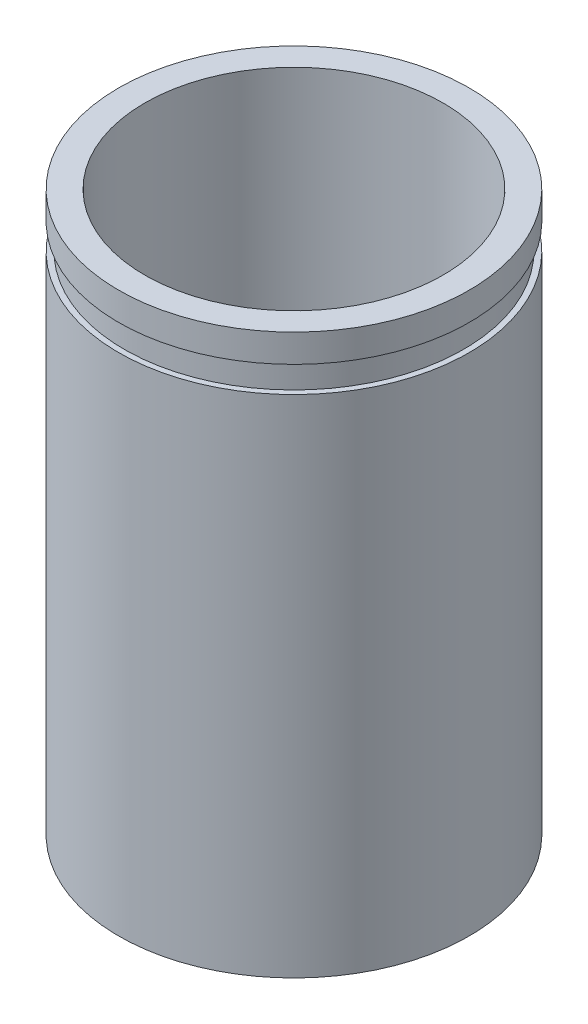
ISO-10303-21;
HEADER;
FILE_DESCRIPTION(('STEP AP214'),'2;1');
FILE_NAME('part.step','',(''),(''),'','','');
FILE_SCHEMA(('AUTOMOTIVE_DESIGN { 1 0 10303 214 1 1 1 1 }'));
ENDSEC;
DATA;
#1=APPLICATION_CONTEXT('core data for automotive mechanical design processes');
#2=APPLICATION_PROTOCOL_DEFINITION('international standard','automotive_design',2000,#1);
#3=PRODUCT_CONTEXT('',#1,'mechanical');
#4=PRODUCT('Part','Part','',(#3));
#5=PRODUCT_RELATED_PRODUCT_CATEGORY('part','',(#4));
#6=PRODUCT_DEFINITION_FORMATION('','',#4);
#7=PRODUCT_DEFINITION_CONTEXT('part definition',#1,'design');
#8=PRODUCT_DEFINITION('design','',#6,#7);
#9=PRODUCT_DEFINITION_SHAPE('','',#8);
#10=(LENGTH_UNIT() NAMED_UNIT(*) SI_UNIT(.MILLI.,.METRE.));
#11=(NAMED_UNIT(*) PLANE_ANGLE_UNIT() SI_UNIT($,.RADIAN.));
#12=(NAMED_UNIT(*) SI_UNIT($,.STERADIAN.) SOLID_ANGLE_UNIT());
#13=UNCERTAINTY_MEASURE_WITH_UNIT(LENGTH_MEASURE(1.E-05),#10,'distance_accuracy_value','');
#14=(GEOMETRIC_REPRESENTATION_CONTEXT(3) GLOBAL_UNCERTAINTY_ASSIGNED_CONTEXT((#13)) GLOBAL_UNIT_ASSIGNED_CONTEXT((#10,
#11,#12)) REPRESENTATION_CONTEXT('',''));
#15=CARTESIAN_POINT('',(0.,0.,0.));
#16=DIRECTION('',(0.,0.,1.));
#17=DIRECTION('',(1.,0.,0.));
#18=AXIS2_PLACEMENT_3D('',#15,#16,#17);
#19=CARTESIAN_POINT('',(-22.7272128154357,134.212365817062,0.));
#20=DIRECTION('',(0.,1.,0.));
#21=DIRECTION('',(-1.,0.,0.));
#22=AXIS2_PLACEMENT_3D('',#19,#20,#21);
#23=CYLINDRICAL_SURFACE('',#22,40.);
#24=CARTESIAN_POINT('',(-22.7272128154357,134.212365817062,0.));
#25=DIRECTION('',(0.,1.,0.));
#26=DIRECTION('',(-1.,0.,0.));
#27=AXIS2_PLACEMENT_3D('',#24,#25,#26);
#28=CIRCLE('',#27,40.);
#29=CARTESIAN_POINT('',(-62.7272128154357,134.212365817062,0.));
#30=VERTEX_POINT('',#29);
#31=EDGE_CURVE('E67',#30,#30,#28,.T.);
#32=ORIENTED_EDGE('',*,*,#31,.T.);
#33=EDGE_LOOP('',(#32));
#34=FACE_BOUND('',#33,.T.);
#35=CARTESIAN_POINT('',(-22.7272128154357,-15.7876341829382,0.));
#36=DIRECTION('',(0.,1.,0.));
#37=DIRECTION('',(-1.,0.,0.));
#38=AXIS2_PLACEMENT_3D('',#35,#36,#37);
#39=CIRCLE('',#38,40.);
#40=CARTESIAN_POINT('',(-62.7272128154357,-15.7876341829382,0.));
#41=VERTEX_POINT('',#40);
#42=EDGE_CURVE('E10',#41,#41,#39,.T.);
#43=ORIENTED_EDGE('',*,*,#42,.F.);
#44=EDGE_LOOP('',(#43));
#45=FACE_BOUND('',#44,.T.);
#46=ADVANCED_FACE('F39',(#34,#45),#23,.F.);
#47=CARTESIAN_POINT('',(0.,-15.7876341829382,0.));
#48=DIRECTION('',(0.,-1.,0.));
#49=DIRECTION('',(1.,0.,0.));
#50=AXIS2_PLACEMENT_3D('',#47,#48,#49);
#51=PLANE('',#50);
#52=ORIENTED_EDGE('',*,*,#42,.T.);
#53=EDGE_LOOP('',(#52));
#54=FACE_BOUND('',#53,.T.);
#55=CARTESIAN_POINT('',(-22.7272128154357,-15.7876341829382,0.));
#56=DIRECTION('',(0.,1.,0.));
#57=DIRECTION('',(-1.,0.,0.));
#58=AXIS2_PLACEMENT_3D('',#55,#56,#57);
#59=CIRCLE('',#58,47.);
#60=CARTESIAN_POINT('',(-69.7272128154357,-15.7876341829382,0.));
#61=VERTEX_POINT('',#60);
#62=EDGE_CURVE('E45',#61,#61,#59,.T.);
#63=ORIENTED_EDGE('',*,*,#62,.F.);
#64=EDGE_LOOP('',(#63));
#65=FACE_BOUND('',#64,.T.);
#66=ADVANCED_FACE('F85',(#54,#65),#51,.T.);
#67=CARTESIAN_POINT('',(-22.7272128154357,134.212365817062,0.));
#68=DIRECTION('',(0.,1.,0.));
#69=DIRECTION('',(-1.,0.,0.));
#70=AXIS2_PLACEMENT_3D('',#67,#68,#69);
#71=CYLINDRICAL_SURFACE('',#70,47.);
#72=ORIENTED_EDGE('',*,*,#62,.T.);
#73=EDGE_LOOP('',(#72));
#74=FACE_BOUND('',#73,.T.);
#75=CARTESIAN_POINT('',(-22.7272128154357,119.712365817062,0.));
#76=DIRECTION('',(0.,1.,0.));
#77=DIRECTION('',(-1.,0.,0.));
#78=AXIS2_PLACEMENT_3D('',#75,#76,#77);
#79=CIRCLE('',#78,47.);
#80=CARTESIAN_POINT('',(-69.7272128154357,119.712365817062,0.));
#81=VERTEX_POINT('',#80);
#82=EDGE_CURVE('E49',#81,#81,#79,.T.);
#83=ORIENTED_EDGE('',*,*,#82,.F.);
#84=EDGE_LOOP('',(#83));
#85=FACE_BOUND('',#84,.T.);
#86=ADVANCED_FACE('F89',(#74,#85),#71,.T.);
#87=CARTESIAN_POINT('',(0.,119.712365817062,0.));
#88=DIRECTION('',(0.,1.,0.));
#89=DIRECTION('',(-1.,0.,0.));
#90=AXIS2_PLACEMENT_3D('',#87,#88,#89);
#91=PLANE('',#90);
#92=ORIENTED_EDGE('',*,*,#82,.T.);
#93=EDGE_LOOP('',(#92));
#94=FACE_BOUND('',#93,.T.);
#95=CARTESIAN_POINT('',(-22.7272128154357,119.712365817062,0.));
#96=DIRECTION('',(0.,1.,0.));
#97=DIRECTION('',(-1.,0.,0.));
#98=AXIS2_PLACEMENT_3D('',#95,#96,#97);
#99=CIRCLE('',#98,45.5);
#100=CARTESIAN_POINT('',(-68.2272128154357,119.712365817062,0.));
#101=VERTEX_POINT('',#100);
#102=EDGE_CURVE('E53',#101,#101,#99,.T.);
#103=ORIENTED_EDGE('',*,*,#102,.F.);
#104=EDGE_LOOP('',(#103));
#105=FACE_BOUND('',#104,.T.);
#106=ADVANCED_FACE('F93',(#94,#105),#91,.T.);
#107=CARTESIAN_POINT('',(-22.7272128154357,134.212365817062,0.));
#108=DIRECTION('',(0.,1.,0.));
#109=DIRECTION('',(-1.,0.,0.));
#110=AXIS2_PLACEMENT_3D('',#107,#108,#109);
#111=CYLINDRICAL_SURFACE('',#110,45.5);
#112=ORIENTED_EDGE('',*,*,#102,.T.);
#113=EDGE_LOOP('',(#112));
#114=FACE_BOUND('',#113,.T.);
#115=CARTESIAN_POINT('',(-22.7272128154357,126.712365817062,0.));
#116=DIRECTION('',(0.,1.,0.));
#117=DIRECTION('',(-1.,0.,0.));
#118=AXIS2_PLACEMENT_3D('',#115,#116,#117);
#119=CIRCLE('',#118,45.5);
#120=CARTESIAN_POINT('',(-68.2272128154357,126.712365817062,0.));
#121=VERTEX_POINT('',#120);
#122=EDGE_CURVE('E58',#121,#121,#119,.T.);
#123=ORIENTED_EDGE('',*,*,#122,.F.);
#124=EDGE_LOOP('',(#123));
#125=FACE_BOUND('',#124,.T.);
#126=ADVANCED_FACE('F99',(#114,#125),#111,.T.);
#127=CARTESIAN_POINT('',(0.,126.712365817062,0.));
#128=DIRECTION('',(0.,-1.,0.));
#129=DIRECTION('',(1.,0.,0.));
#130=AXIS2_PLACEMENT_3D('',#127,#128,#129);
#131=PLANE('',#130);
#132=ORIENTED_EDGE('',*,*,#122,.T.);
#133=EDGE_LOOP('',(#132));
#134=FACE_BOUND('',#133,.T.);
#135=CARTESIAN_POINT('',(-22.7272128154357,126.712365817062,0.));
#136=DIRECTION('',(0.,1.,0.));
#137=DIRECTION('',(-1.,0.,0.));
#138=AXIS2_PLACEMENT_3D('',#135,#136,#137);
#139=CIRCLE('',#138,47.);
#140=CARTESIAN_POINT('',(-69.7272128154357,126.712365817062,0.));
#141=VERTEX_POINT('',#140);
#142=EDGE_CURVE('E61',#141,#141,#139,.T.);
#143=ORIENTED_EDGE('',*,*,#142,.F.);
#144=EDGE_LOOP('',(#143));
#145=FACE_BOUND('',#144,.T.);
#146=ADVANCED_FACE('F81',(#134,#145),#131,.T.);
#147=CARTESIAN_POINT('',(-22.7272128154357,134.212365817062,0.));
#148=DIRECTION('',(0.,1.,0.));
#149=DIRECTION('',(-1.,0.,0.));
#150=AXIS2_PLACEMENT_3D('',#147,#148,#149);
#151=CYLINDRICAL_SURFACE('',#150,47.);
#152=ORIENTED_EDGE('',*,*,#142,.T.);
#153=EDGE_LOOP('',(#152));
#154=FACE_BOUND('',#153,.T.);
#155=CARTESIAN_POINT('',(-22.7272128154357,134.212365817062,0.));
#156=DIRECTION('',(0.,1.,0.));
#157=DIRECTION('',(-1.,0.,0.));
#158=AXIS2_PLACEMENT_3D('',#155,#156,#157);
#159=CIRCLE('',#158,47.);
#160=CARTESIAN_POINT('',(-69.7272128154357,134.212365817062,0.));
#161=VERTEX_POINT('',#160);
#162=EDGE_CURVE('E64',#161,#161,#159,.T.);
#163=ORIENTED_EDGE('',*,*,#162,.F.);
#164=EDGE_LOOP('',(#163));
#165=FACE_BOUND('',#164,.T.);
#166=ADVANCED_FACE('F75',(#154,#165),#151,.T.);
#167=CARTESIAN_POINT('',(0.,134.212365817062,0.));
#168=DIRECTION('',(0.,1.,0.));
#169=DIRECTION('',(-1.,0.,0.));
#170=AXIS2_PLACEMENT_3D('',#167,#168,#169);
#171=PLANE('',#170);
#172=ORIENTED_EDGE('',*,*,#162,.T.);
#173=EDGE_LOOP('',(#172));
#174=FACE_BOUND('',#173,.T.);
#175=ORIENTED_EDGE('',*,*,#31,.F.);
#176=EDGE_LOOP('',(#175));
#177=FACE_BOUND('',#176,.T.);
#178=ADVANCED_FACE('F73',(#174,#177),#171,.T.);
#179=CLOSED_SHELL('',(#46,#66,#86,#106,#126,#146,#166,#178));
#180=MANIFOLD_SOLID_BREP('B2',#179);
#181=ADVANCED_BREP_SHAPE_REPRESENTATION('',(#18,#180),#14);
#182=SHAPE_DEFINITION_REPRESENTATION(#9,#181);
ENDSEC;
END-ISO-10303-21;
